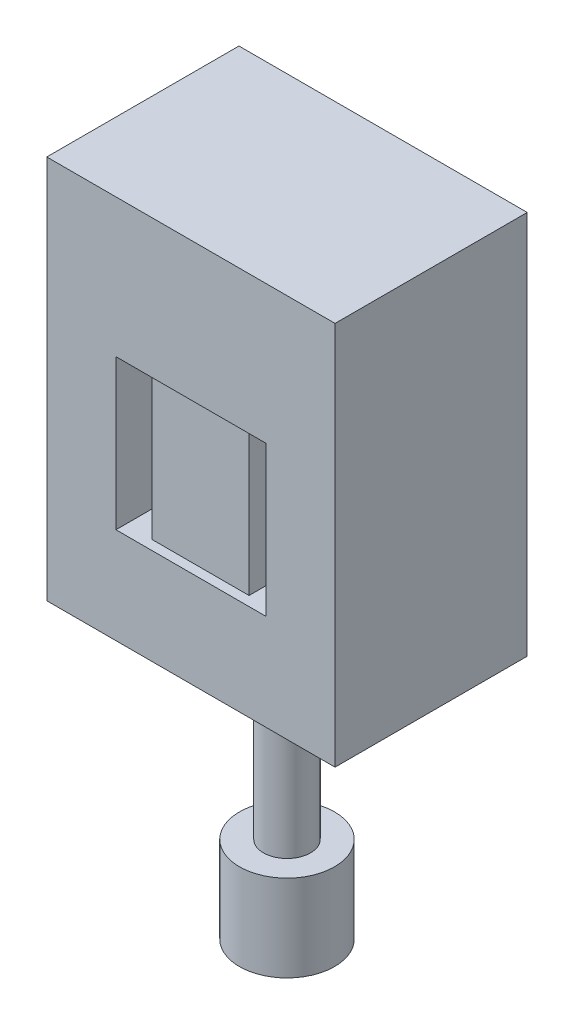
ISO-10303-21;
HEADER;
FILE_DESCRIPTION(('STEP AP214'),'2;1');
FILE_NAME('part.step','',(''),(''),'','','');
FILE_SCHEMA(('AUTOMOTIVE_DESIGN { 1 0 10303 214 1 1 1 1 }'));
ENDSEC;
DATA;
#1=APPLICATION_CONTEXT('core data for automotive mechanical design processes');
#2=APPLICATION_PROTOCOL_DEFINITION('international standard','automotive_design',2000,#1);
#3=PRODUCT_CONTEXT('',#1,'mechanical');
#4=PRODUCT('Part','Part','',(#3));
#5=PRODUCT_RELATED_PRODUCT_CATEGORY('part','',(#4));
#6=PRODUCT_DEFINITION_FORMATION('','',#4);
#7=PRODUCT_DEFINITION_CONTEXT('part definition',#1,'design');
#8=PRODUCT_DEFINITION('design','',#6,#7);
#9=PRODUCT_DEFINITION_SHAPE('','',#8);
#10=(LENGTH_UNIT() NAMED_UNIT(*) SI_UNIT(.MILLI.,.METRE.));
#11=(NAMED_UNIT(*) PLANE_ANGLE_UNIT() SI_UNIT($,.RADIAN.));
#12=(NAMED_UNIT(*) SI_UNIT($,.STERADIAN.) SOLID_ANGLE_UNIT());
#13=UNCERTAINTY_MEASURE_WITH_UNIT(LENGTH_MEASURE(1.E-05),#10,'distance_accuracy_value','');
#14=(GEOMETRIC_REPRESENTATION_CONTEXT(3) GLOBAL_UNCERTAINTY_ASSIGNED_CONTEXT((#13)) GLOBAL_UNIT_ASSIGNED_CONTEXT((#10,
#11,#12)) REPRESENTATION_CONTEXT('',''));
#15=CARTESIAN_POINT('',(0.,0.,0.));
#16=DIRECTION('',(0.,0.,1.));
#17=DIRECTION('',(1.,0.,0.));
#18=AXIS2_PLACEMENT_3D('',#15,#16,#17);
#19=CARTESIAN_POINT('',(0.,0.,9.));
#20=DIRECTION('',(0.,0.,-1.));
#21=DIRECTION('',(-1.,0.,0.));
#22=AXIS2_PLACEMENT_3D('',#19,#20,#21);
#23=PLANE('',#22);
#24=DIRECTION('',(0.,1.,0.));
#25=VECTOR('',#24,1.);
#26=CARTESIAN_POINT('',(-5.05,25.6,9.));
#27=LINE('',#26,#25);
#28=CARTESIAN_POINT('',(-5.05,10.,9.));
#29=VERTEX_POINT('',#28);
#30=CARTESIAN_POINT('',(-5.05,25.6,9.));
#31=VERTEX_POINT('',#30);
#32=EDGE_CURVE('E164',#29,#31,#27,.T.);
#33=ORIENTED_EDGE('',*,*,#32,.F.);
#34=DIRECTION('',(1.,0.,0.));
#35=VECTOR('',#34,1.);
#36=CARTESIAN_POINT('',(-7.8,10.,9.));
#37=LINE('',#36,#35);
#38=CARTESIAN_POINT('',(5.05,10.,9.));
#39=VERTEX_POINT('',#38);
#40=EDGE_CURVE('E207',#29,#39,#37,.T.);
#41=ORIENTED_EDGE('',*,*,#40,.T.);
#42=DIRECTION('',(0.,-1.,0.));
#43=VECTOR('',#42,1.);
#44=CARTESIAN_POINT('',(5.05,25.6,9.));
#45=LINE('',#44,#43);
#46=CARTESIAN_POINT('',(5.05,25.6,9.));
#47=VERTEX_POINT('',#46);
#48=EDGE_CURVE('E167',#47,#39,#45,.T.);
#49=ORIENTED_EDGE('',*,*,#48,.F.);
#50=DIRECTION('',(-1.,0.,0.));
#51=VECTOR('',#50,1.);
#52=CARTESIAN_POINT('',(-7.8,25.6,9.));
#53=LINE('',#52,#51);
#54=EDGE_CURVE('E203',#47,#31,#53,.T.);
#55=ORIENTED_EDGE('',*,*,#54,.T.);
#56=EDGE_LOOP('',(#33,#41,#49,#55));
#57=FACE_BOUND('',#56,.T.);
#58=ADVANCED_FACE('F44',(#57),#23,.F.);
#59=CARTESIAN_POINT('',(15.,40.,10.));
#60=DIRECTION('',(-1.,0.,0.));
#61=DIRECTION('',(0.,0.,1.));
#62=AXIS2_PLACEMENT_3D('',#59,#60,#61);
#63=PLANE('',#62);
#64=DIRECTION('',(0.,0.,-1.));
#65=VECTOR('',#64,1.);
#66=CARTESIAN_POINT('',(15.,0.,10.));
#67=LINE('',#66,#65);
#68=CARTESIAN_POINT('',(15.,0.,10.));
#69=VERTEX_POINT('',#68);
#70=CARTESIAN_POINT('',(15.,0.,-10.));
#71=VERTEX_POINT('',#70);
#72=EDGE_CURVE('E242',#69,#71,#67,.T.);
#73=ORIENTED_EDGE('',*,*,#72,.T.);
#74=DIRECTION('',(0.,-1.,0.));
#75=VECTOR('',#74,1.);
#76=CARTESIAN_POINT('',(15.,40.,-10.));
#77=LINE('',#76,#75);
#78=CARTESIAN_POINT('',(15.,40.,-10.));
#79=VERTEX_POINT('',#78);
#80=EDGE_CURVE('E280',#79,#71,#77,.T.);
#81=ORIENTED_EDGE('',*,*,#80,.F.);
#82=DIRECTION('',(0.,0.,-1.));
#83=VECTOR('',#82,1.);
#84=CARTESIAN_POINT('',(15.,40.,10.));
#85=LINE('',#84,#83);
#86=CARTESIAN_POINT('',(15.,40.,10.));
#87=VERTEX_POINT('',#86);
#88=EDGE_CURVE('E243',#87,#79,#85,.T.);
#89=ORIENTED_EDGE('',*,*,#88,.F.);
#90=DIRECTION('',(0.,-1.,0.));
#91=VECTOR('',#90,1.);
#92=CARTESIAN_POINT('',(15.,40.,10.));
#93=LINE('',#92,#91);
#94=EDGE_CURVE('E257',#87,#69,#93,.T.);
#95=ORIENTED_EDGE('',*,*,#94,.T.);
#96=EDGE_LOOP('',(#73,#81,#89,#95));
#97=FACE_BOUND('',#96,.T.);
#98=ADVANCED_FACE('F300',(#97),#63,.F.);
#99=CARTESIAN_POINT('',(-15.,40.,-10.));
#100=DIRECTION('',(0.,0.,1.));
#101=DIRECTION('',(1.,0.,0.));
#102=AXIS2_PLACEMENT_3D('',#99,#100,#101);
#103=PLANE('',#102);
#104=DIRECTION('',(-1.,0.,0.));
#105=VECTOR('',#104,1.);
#106=CARTESIAN_POINT('',(-15.,0.,-10.));
#107=LINE('',#106,#105);
#108=CARTESIAN_POINT('',(-15.,0.,-10.));
#109=VERTEX_POINT('',#108);
#110=EDGE_CURVE('E261',#71,#109,#107,.T.);
#111=ORIENTED_EDGE('',*,*,#110,.T.);
#112=DIRECTION('',(0.,-1.,0.));
#113=VECTOR('',#112,1.);
#114=CARTESIAN_POINT('',(-15.,40.,-10.));
#115=LINE('',#114,#113);
#116=CARTESIAN_POINT('',(-15.,40.,-10.));
#117=VERTEX_POINT('',#116);
#118=EDGE_CURVE('E276',#117,#109,#115,.T.);
#119=ORIENTED_EDGE('',*,*,#118,.F.);
#120=DIRECTION('',(-1.,0.,0.));
#121=VECTOR('',#120,1.);
#122=CARTESIAN_POINT('',(-15.,40.,-10.));
#123=LINE('',#122,#121);
#124=EDGE_CURVE('E247',#79,#117,#123,.T.);
#125=ORIENTED_EDGE('',*,*,#124,.F.);
#126=ORIENTED_EDGE('',*,*,#80,.T.);
#127=EDGE_LOOP('',(#111,#119,#125,#126));
#128=FACE_BOUND('',#127,.T.);
#129=ADVANCED_FACE('F308',(#128),#103,.F.);
#130=CARTESIAN_POINT('',(-15.,40.,10.));
#131=DIRECTION('',(1.,0.,0.));
#132=DIRECTION('',(0.,0.,-1.));
#133=AXIS2_PLACEMENT_3D('',#130,#131,#132);
#134=PLANE('',#133);
#135=DIRECTION('',(0.,0.,1.));
#136=VECTOR('',#135,1.);
#137=CARTESIAN_POINT('',(-15.,0.,10.));
#138=LINE('',#137,#136);
#139=CARTESIAN_POINT('',(-15.,0.,10.));
#140=VERTEX_POINT('',#139);
#141=EDGE_CURVE('E264',#109,#140,#138,.T.);
#142=ORIENTED_EDGE('',*,*,#141,.T.);
#143=DIRECTION('',(0.,-1.,0.));
#144=VECTOR('',#143,1.);
#145=CARTESIAN_POINT('',(-15.,40.,10.));
#146=LINE('',#145,#144);
#147=CARTESIAN_POINT('',(-15.,40.,10.));
#148=VERTEX_POINT('',#147);
#149=EDGE_CURVE('E272',#148,#140,#146,.T.);
#150=ORIENTED_EDGE('',*,*,#149,.F.);
#151=DIRECTION('',(0.,0.,1.));
#152=VECTOR('',#151,1.);
#153=CARTESIAN_POINT('',(-15.,40.,10.));
#154=LINE('',#153,#152);
#155=EDGE_CURVE('E251',#117,#148,#154,.T.);
#156=ORIENTED_EDGE('',*,*,#155,.F.);
#157=ORIENTED_EDGE('',*,*,#118,.T.);
#158=EDGE_LOOP('',(#142,#150,#156,#157));
#159=FACE_BOUND('',#158,.T.);
#160=ADVANCED_FACE('F349',(#159),#134,.F.);
#161=CARTESIAN_POINT('',(-15.,40.,10.));
#162=DIRECTION('',(0.,0.,-1.));
#163=DIRECTION('',(-1.,0.,0.));
#164=AXIS2_PLACEMENT_3D('',#161,#162,#163);
#165=PLANE('',#164);
#166=DIRECTION('',(-1.,0.,0.));
#167=VECTOR('',#166,1.);
#168=CARTESIAN_POINT('',(-7.8,25.6,10.));
#169=LINE('',#168,#167);
#170=CARTESIAN_POINT('',(7.79999999999999,25.6,10.));
#171=VERTEX_POINT('',#170);
#172=CARTESIAN_POINT('',(-7.8,25.6,10.));
#173=VERTEX_POINT('',#172);
#174=EDGE_CURVE('E215',#171,#173,#169,.T.);
#175=ORIENTED_EDGE('',*,*,#174,.F.);
#176=DIRECTION('',(0.,1.,0.));
#177=VECTOR('',#176,1.);
#178=CARTESIAN_POINT('',(7.79999999999999,10.,10.));
#179=LINE('',#178,#177);
#180=CARTESIAN_POINT('',(7.79999999999999,10.,10.));
#181=VERTEX_POINT('',#180);
#182=EDGE_CURVE('E177',#181,#171,#179,.T.);
#183=ORIENTED_EDGE('',*,*,#182,.F.);
#184=DIRECTION('',(1.,0.,0.));
#185=VECTOR('',#184,1.);
#186=CARTESIAN_POINT('',(-7.8,10.,10.));
#187=LINE('',#186,#185);
#188=CARTESIAN_POINT('',(-7.8,10.,10.));
#189=VERTEX_POINT('',#188);
#190=EDGE_CURVE('E208',#189,#181,#187,.T.);
#191=ORIENTED_EDGE('',*,*,#190,.F.);
#192=DIRECTION('',(0.,-1.,0.));
#193=VECTOR('',#192,1.);
#194=CARTESIAN_POINT('',(-7.8,10.,10.));
#195=LINE('',#194,#193);
#196=EDGE_CURVE('E143',#173,#189,#195,.T.);
#197=ORIENTED_EDGE('',*,*,#196,.F.);
#198=EDGE_LOOP('',(#175,#183,#191,#197));
#199=FACE_BOUND('',#198,.T.);
#200=DIRECTION('',(1.,0.,0.));
#201=VECTOR('',#200,1.);
#202=CARTESIAN_POINT('',(-15.,0.,10.));
#203=LINE('',#202,#201);
#204=EDGE_CURVE('E248',#140,#69,#203,.T.);
#205=ORIENTED_EDGE('',*,*,#204,.T.);
#206=ORIENTED_EDGE('',*,*,#94,.F.);
#207=DIRECTION('',(1.,0.,0.));
#208=VECTOR('',#207,1.);
#209=CARTESIAN_POINT('',(-15.,40.,10.));
#210=LINE('',#209,#208);
#211=EDGE_CURVE('E254',#148,#87,#210,.T.);
#212=ORIENTED_EDGE('',*,*,#211,.F.);
#213=ORIENTED_EDGE('',*,*,#149,.T.);
#214=EDGE_LOOP('',(#205,#206,#212,#213));
#215=FACE_BOUND('',#214,.T.);
#216=ADVANCED_FACE('F343',(#199,#215),#165,.F.);
#217=CARTESIAN_POINT('',(0.,40.,0.));
#218=DIRECTION('',(0.,-1.,0.));
#219=DIRECTION('',(0.,0.,-1.));
#220=AXIS2_PLACEMENT_3D('',#217,#218,#219);
#221=PLANE('',#220);
#222=ORIENTED_EDGE('',*,*,#88,.T.);
#223=ORIENTED_EDGE('',*,*,#124,.T.);
#224=ORIENTED_EDGE('',*,*,#155,.T.);
#225=ORIENTED_EDGE('',*,*,#211,.T.);
#226=EDGE_LOOP('',(#222,#223,#224,#225));
#227=FACE_BOUND('',#226,.T.);
#228=ADVANCED_FACE('F340',(#227),#221,.F.);
#229=CARTESIAN_POINT('',(0.,0.,0.));
#230=DIRECTION('',(0.,-1.,0.));
#231=DIRECTION('',(0.,0.,-1.));
#232=AXIS2_PLACEMENT_3D('',#229,#230,#231);
#233=PLANE('',#232);
#234=CARTESIAN_POINT('',(0.,0.,0.));
#235=DIRECTION('',(0.,-1.,0.));
#236=DIRECTION('',(0.,0.,-1.));
#237=AXIS2_PLACEMENT_3D('',#234,#235,#236);
#238=CIRCLE('',#237,5.45);
#239=CARTESIAN_POINT('',(0.,0.,-5.45));
#240=VERTEX_POINT('',#239);
#241=EDGE_CURVE('E11',#240,#240,#238,.F.);
#242=ORIENTED_EDGE('',*,*,#241,.T.);
#243=EDGE_LOOP('',(#242));
#244=FACE_BOUND('',#243,.T.);
#245=ORIENTED_EDGE('',*,*,#72,.F.);
#246=ORIENTED_EDGE('',*,*,#204,.F.);
#247=ORIENTED_EDGE('',*,*,#141,.F.);
#248=ORIENTED_EDGE('',*,*,#110,.F.);
#249=EDGE_LOOP('',(#245,#246,#247,#248));
#250=FACE_BOUND('',#249,.T.);
#251=ADVANCED_FACE('F339',(#244,#250),#233,.T.);
#252=CARTESIAN_POINT('',(0.,-19.,0.));
#253=DIRECTION('',(0.,1.,0.));
#254=DIRECTION('',(0.,0.,1.));
#255=AXIS2_PLACEMENT_3D('',#252,#253,#254);
#256=CYLINDRICAL_SURFACE('',#255,2.45);
#257=CARTESIAN_POINT('',(0.,-3.,0.));
#258=DIRECTION('',(0.,-1.,0.));
#259=DIRECTION('',(0.,0.,-1.));
#260=AXIS2_PLACEMENT_3D('',#257,#258,#259);
#261=CIRCLE('',#260,2.45);
#262=CARTESIAN_POINT('',(0.,-3.,-2.45));
#263=VERTEX_POINT('',#262);
#264=EDGE_CURVE('E53',#263,#263,#261,.T.);
#265=ORIENTED_EDGE('',*,*,#264,.T.);
#266=EDGE_LOOP('',(#265));
#267=FACE_BOUND('',#266,.T.);
#268=CARTESIAN_POINT('',(0.,-19.,0.));
#269=DIRECTION('',(0.,-1.,0.));
#270=DIRECTION('',(0.,0.,-1.));
#271=AXIS2_PLACEMENT_3D('',#268,#269,#270);
#272=CIRCLE('',#271,2.45);
#273=CARTESIAN_POINT('',(0.,-19.,-2.45));
#274=VERTEX_POINT('',#273);
#275=EDGE_CURVE('E235',#274,#274,#272,.T.);
#276=ORIENTED_EDGE('',*,*,#275,.F.);
#277=EDGE_LOOP('',(#276));
#278=FACE_BOUND('',#277,.T.);
#279=ADVANCED_FACE('F287',(#267,#278),#256,.T.);
#280=CARTESIAN_POINT('',(0.,-28.,0.));
#281=DIRECTION('',(0.,1.,0.));
#282=DIRECTION('',(0.,0.,1.));
#283=AXIS2_PLACEMENT_3D('',#280,#281,#282);
#284=CYLINDRICAL_SURFACE('',#283,4.95);
#285=CARTESIAN_POINT('',(0.,-28.,0.));
#286=DIRECTION('',(0.,-1.,0.));
#287=DIRECTION('',(0.,0.,-1.));
#288=AXIS2_PLACEMENT_3D('',#285,#286,#287);
#289=CIRCLE('',#288,4.95);
#290=CARTESIAN_POINT('',(0.,-28.,-4.95));
#291=VERTEX_POINT('',#290);
#292=EDGE_CURVE('E231',#291,#291,#289,.T.);
#293=ORIENTED_EDGE('',*,*,#292,.F.);
#294=EDGE_LOOP('',(#293));
#295=FACE_BOUND('',#294,.T.);
#296=CARTESIAN_POINT('',(0.,-19.,0.));
#297=DIRECTION('',(0.,-1.,0.));
#298=DIRECTION('',(0.,0.,-1.));
#299=AXIS2_PLACEMENT_3D('',#296,#297,#298);
#300=CIRCLE('',#299,4.95);
#301=CARTESIAN_POINT('',(0.,-19.,-4.95));
#302=VERTEX_POINT('',#301);
#303=EDGE_CURVE('E224',#302,#302,#300,.T.);
#304=ORIENTED_EDGE('',*,*,#303,.T.);
#305=EDGE_LOOP('',(#304));
#306=FACE_BOUND('',#305,.T.);
#307=ADVANCED_FACE('F330',(#295,#306),#284,.T.);
#308=CARTESIAN_POINT('',(0.,-28.,0.));
#309=DIRECTION('',(0.,-1.,0.));
#310=DIRECTION('',(0.,0.,-1.));
#311=AXIS2_PLACEMENT_3D('',#308,#309,#310);
#312=PLANE('',#311);
#313=ORIENTED_EDGE('',*,*,#292,.T.);
#314=EDGE_LOOP('',(#313));
#315=FACE_BOUND('',#314,.T.);
#316=ADVANCED_FACE('F327',(#315),#312,.T.);
#317=CARTESIAN_POINT('',(0.,-19.,0.));
#318=DIRECTION('',(0.,-1.,0.));
#319=DIRECTION('',(0.,0.,-1.));
#320=AXIS2_PLACEMENT_3D('',#317,#318,#319);
#321=PLANE('',#320);
#322=ORIENTED_EDGE('',*,*,#275,.T.);
#323=EDGE_LOOP('',(#322));
#324=FACE_BOUND('',#323,.T.);
#325=ORIENTED_EDGE('',*,*,#303,.F.);
#326=EDGE_LOOP('',(#325));
#327=FACE_BOUND('',#326,.T.);
#328=ADVANCED_FACE('F325',(#324,#327),#321,.F.);
#329=CARTESIAN_POINT('',(7.79999999999999,10.,9.));
#330=DIRECTION('',(1.,0.,0.));
#331=DIRECTION('',(0.,1.,0.));
#332=AXIS2_PLACEMENT_3D('',#329,#330,#331);
#333=PLANE('',#332);
#334=ORIENTED_EDGE('',*,*,#182,.T.);
#335=DIRECTION('',(0.,0.,1.));
#336=VECTOR('',#335,1.);
#337=CARTESIAN_POINT('',(7.8,25.6,9.));
#338=LINE('',#337,#336);
#339=CARTESIAN_POINT('',(7.79999999999999,25.6,6.));
#340=VERTEX_POINT('',#339);
#341=EDGE_CURVE('E212',#340,#171,#338,.T.);
#342=ORIENTED_EDGE('',*,*,#341,.F.);
#343=DIRECTION('',(0.,1.,0.));
#344=VECTOR('',#343,1.);
#345=CARTESIAN_POINT('',(7.79999999999999,25.6,6.));
#346=LINE('',#345,#344);
#347=CARTESIAN_POINT('',(7.79999999999999,10.,6.));
#348=VERTEX_POINT('',#347);
#349=EDGE_CURVE('E188',#348,#340,#346,.T.);
#350=ORIENTED_EDGE('',*,*,#349,.F.);
#351=DIRECTION('',(0.,0.,1.));
#352=VECTOR('',#351,1.);
#353=CARTESIAN_POINT('',(7.79999999999999,10.,9.));
#354=LINE('',#353,#352);
#355=EDGE_CURVE('E148',#348,#181,#354,.T.);
#356=ORIENTED_EDGE('',*,*,#355,.T.);
#357=EDGE_LOOP('',(#334,#342,#350,#356));
#358=FACE_BOUND('',#357,.T.);
#359=ADVANCED_FACE('F316',(#358),#333,.F.);
#360=CARTESIAN_POINT('',(-7.8,10.,9.));
#361=DIRECTION('',(0.,-1.,0.));
#362=DIRECTION('',(0.,0.,-1.));
#363=AXIS2_PLACEMENT_3D('',#360,#361,#362);
#364=PLANE('',#363);
#365=ORIENTED_EDGE('',*,*,#190,.T.);
#366=ORIENTED_EDGE('',*,*,#355,.F.);
#367=DIRECTION('',(1.,0.,0.));
#368=VECTOR('',#367,1.);
#369=CARTESIAN_POINT('',(7.79999999999999,10.,6.));
#370=LINE('',#369,#368);
#371=CARTESIAN_POINT('',(5.05,10.,6.));
#372=VERTEX_POINT('',#371);
#373=EDGE_CURVE('E182',#372,#348,#370,.T.);
#374=ORIENTED_EDGE('',*,*,#373,.F.);
#375=DIRECTION('',(0.,0.,1.));
#376=VECTOR('',#375,1.);
#377=CARTESIAN_POINT('',(5.05,10.,6.));
#378=LINE('',#377,#376);
#379=EDGE_CURVE('E183',#372,#39,#378,.T.);
#380=ORIENTED_EDGE('',*,*,#379,.T.);
#381=ORIENTED_EDGE('',*,*,#40,.F.);
#382=DIRECTION('',(0.,0.,1.));
#383=VECTOR('',#382,1.);
#384=CARTESIAN_POINT('',(-5.05,10.,6.));
#385=LINE('',#384,#383);
#386=CARTESIAN_POINT('',(-5.05,10.,6.));
#387=VERTEX_POINT('',#386);
#388=EDGE_CURVE('E60',#387,#29,#385,.T.);
#389=ORIENTED_EDGE('',*,*,#388,.F.);
#390=DIRECTION('',(1.,0.,0.));
#391=VECTOR('',#390,1.);
#392=CARTESIAN_POINT('',(-7.8,10.,6.));
#393=LINE('',#392,#391);
#394=CARTESIAN_POINT('',(-7.8,10.,6.));
#395=VERTEX_POINT('',#394);
#396=EDGE_CURVE('E152',#395,#387,#393,.T.);
#397=ORIENTED_EDGE('',*,*,#396,.F.);
#398=DIRECTION('',(0.,0.,1.));
#399=VECTOR('',#398,1.);
#400=CARTESIAN_POINT('',(-7.8,10.,9.));
#401=LINE('',#400,#399);
#402=EDGE_CURVE('E136',#395,#189,#401,.T.);
#403=ORIENTED_EDGE('',*,*,#402,.T.);
#404=EDGE_LOOP('',(#365,#366,#374,#380,#381,#389,#397,#403));
#405=FACE_BOUND('',#404,.T.);
#406=ADVANCED_FACE('F153',(#405),#364,.F.);
#407=CARTESIAN_POINT('',(-7.8,10.,9.));
#408=DIRECTION('',(-1.,0.,0.));
#409=DIRECTION('',(0.,0.,1.));
#410=AXIS2_PLACEMENT_3D('',#407,#408,#409);
#411=PLANE('',#410);
#412=ORIENTED_EDGE('',*,*,#196,.T.);
#413=ORIENTED_EDGE('',*,*,#402,.F.);
#414=DIRECTION('',(0.,-1.,0.));
#415=VECTOR('',#414,1.);
#416=CARTESIAN_POINT('',(-7.8,25.6,6.));
#417=LINE('',#416,#415);
#418=CARTESIAN_POINT('',(-7.8,25.6,6.));
#419=VERTEX_POINT('',#418);
#420=EDGE_CURVE('E140',#419,#395,#417,.T.);
#421=ORIENTED_EDGE('',*,*,#420,.F.);
#422=DIRECTION('',(0.,0.,1.));
#423=VECTOR('',#422,1.);
#424=CARTESIAN_POINT('',(-7.8,25.6,9.));
#425=LINE('',#424,#423);
#426=EDGE_CURVE('E149',#419,#173,#425,.T.);
#427=ORIENTED_EDGE('',*,*,#426,.T.);
#428=EDGE_LOOP('',(#412,#413,#421,#427));
#429=FACE_BOUND('',#428,.T.);
#430=ADVANCED_FACE('F138',(#429),#411,.F.);
#431=CARTESIAN_POINT('',(-7.8,25.6,9.));
#432=DIRECTION('',(0.,1.,0.));
#433=DIRECTION('',(0.,0.,1.));
#434=AXIS2_PLACEMENT_3D('',#431,#432,#433);
#435=PLANE('',#434);
#436=ORIENTED_EDGE('',*,*,#174,.T.);
#437=ORIENTED_EDGE('',*,*,#426,.F.);
#438=DIRECTION('',(-1.,0.,0.));
#439=VECTOR('',#438,1.);
#440=CARTESIAN_POINT('',(-7.8,25.6,6.));
#441=LINE('',#440,#439);
#442=CARTESIAN_POINT('',(-5.05,25.6,6.));
#443=VERTEX_POINT('',#442);
#444=EDGE_CURVE('E162',#443,#419,#441,.T.);
#445=ORIENTED_EDGE('',*,*,#444,.F.);
#446=DIRECTION('',(0.,0.,1.));
#447=VECTOR('',#446,1.);
#448=CARTESIAN_POINT('',(-5.05,25.6,6.));
#449=LINE('',#448,#447);
#450=EDGE_CURVE('E174',#443,#31,#449,.T.);
#451=ORIENTED_EDGE('',*,*,#450,.T.);
#452=ORIENTED_EDGE('',*,*,#54,.F.);
#453=DIRECTION('',(0.,0.,1.));
#454=VECTOR('',#453,1.);
#455=CARTESIAN_POINT('',(5.05,25.6,6.));
#456=LINE('',#455,#454);
#457=CARTESIAN_POINT('',(5.05,25.6,6.));
#458=VERTEX_POINT('',#457);
#459=EDGE_CURVE('E68',#458,#47,#456,.T.);
#460=ORIENTED_EDGE('',*,*,#459,.F.);
#461=DIRECTION('',(-1.,0.,0.));
#462=VECTOR('',#461,1.);
#463=CARTESIAN_POINT('',(7.79999999999999,25.6,6.));
#464=LINE('',#463,#462);
#465=EDGE_CURVE('E196',#340,#458,#464,.T.);
#466=ORIENTED_EDGE('',*,*,#465,.F.);
#467=ORIENTED_EDGE('',*,*,#341,.T.);
#468=EDGE_LOOP('',(#436,#437,#445,#451,#452,#460,#466,#467));
#469=FACE_BOUND('',#468,.T.);
#470=ADVANCED_FACE('F319',(#469),#435,.F.);
#471=CARTESIAN_POINT('',(5.05,25.6,6.));
#472=DIRECTION('',(-1.,0.,0.));
#473=DIRECTION('',(0.,-1.,0.));
#474=AXIS2_PLACEMENT_3D('',#471,#472,#473);
#475=PLANE('',#474);
#476=ORIENTED_EDGE('',*,*,#48,.T.);
#477=ORIENTED_EDGE('',*,*,#379,.F.);
#478=DIRECTION('',(0.,-1.,0.));
#479=VECTOR('',#478,1.);
#480=CARTESIAN_POINT('',(5.05,25.6,6.));
#481=LINE('',#480,#479);
#482=EDGE_CURVE('E192',#458,#372,#481,.T.);
#483=ORIENTED_EDGE('',*,*,#482,.F.);
#484=ORIENTED_EDGE('',*,*,#459,.T.);
#485=EDGE_LOOP('',(#476,#477,#483,#484));
#486=FACE_BOUND('',#485,.T.);
#487=ADVANCED_FACE('F322',(#486),#475,.F.);
#488=CARTESIAN_POINT('',(0.,0.,6.));
#489=DIRECTION('',(0.,0.,-1.));
#490=DIRECTION('',(-1.,0.,0.));
#491=AXIS2_PLACEMENT_3D('',#488,#489,#490);
#492=PLANE('',#491);
#493=ORIENTED_EDGE('',*,*,#349,.T.);
#494=ORIENTED_EDGE('',*,*,#465,.T.);
#495=ORIENTED_EDGE('',*,*,#482,.T.);
#496=ORIENTED_EDGE('',*,*,#373,.T.);
#497=EDGE_LOOP('',(#493,#494,#495,#496));
#498=FACE_BOUND('',#497,.T.);
#499=ADVANCED_FACE('F312',(#498),#492,.F.);
#500=CARTESIAN_POINT('',(-5.05,25.6,6.));
#501=DIRECTION('',(1.,0.,0.));
#502=DIRECTION('',(0.,0.,-1.));
#503=AXIS2_PLACEMENT_3D('',#500,#501,#502);
#504=PLANE('',#503);
#505=ORIENTED_EDGE('',*,*,#32,.T.);
#506=ORIENTED_EDGE('',*,*,#450,.F.);
#507=DIRECTION('',(0.,1.,0.));
#508=VECTOR('',#507,1.);
#509=CARTESIAN_POINT('',(-5.05,25.6,6.));
#510=LINE('',#509,#508);
#511=EDGE_CURVE('E158',#387,#443,#510,.T.);
#512=ORIENTED_EDGE('',*,*,#511,.F.);
#513=ORIENTED_EDGE('',*,*,#388,.T.);
#514=EDGE_LOOP('',(#505,#506,#512,#513));
#515=FACE_BOUND('',#514,.T.);
#516=ADVANCED_FACE('F296',(#515),#504,.F.);
#517=CARTESIAN_POINT('',(0.,0.,6.));
#518=DIRECTION('',(0.,0.,1.));
#519=DIRECTION('',(1.,0.,0.));
#520=AXIS2_PLACEMENT_3D('',#517,#518,#519);
#521=PLANE('',#520);
#522=ORIENTED_EDGE('',*,*,#420,.T.);
#523=ORIENTED_EDGE('',*,*,#396,.T.);
#524=ORIENTED_EDGE('',*,*,#511,.T.);
#525=ORIENTED_EDGE('',*,*,#444,.T.);
#526=EDGE_LOOP('',(#522,#523,#524,#525));
#527=FACE_BOUND('',#526,.T.);
#528=ADVANCED_FACE('F160',(#527),#521,.T.);
#529=CARTESIAN_POINT('',(0.,-3.,0.));
#530=DIRECTION('',(0.,-1.,0.));
#531=DIRECTION('',(0.,0.,-1.));
#532=AXIS2_PLACEMENT_3D('',#529,#530,#531);
#533=TOROIDAL_SURFACE('',#532,5.45,3.);
#534=ORIENTED_EDGE('',*,*,#241,.F.);
#535=EDGE_LOOP('',(#534));
#536=FACE_BOUND('',#535,.T.);
#537=ORIENTED_EDGE('',*,*,#264,.F.);
#538=EDGE_LOOP('',(#537));
#539=FACE_BOUND('',#538,.T.);
#540=ADVANCED_FACE('F46',(#536,#539),#533,.F.);
#541=CLOSED_SHELL('',(#58,#98,#129,#160,#216,#228,#251,#279,#307,#316,#328,#359,#406,#430,#470,
#487,#499,#516,#528,#540));
#542=MANIFOLD_SOLID_BREP('B2',#541);
#543=ADVANCED_BREP_SHAPE_REPRESENTATION('',(#18,#542),#14);
#544=SHAPE_DEFINITION_REPRESENTATION(#9,#543);
ENDSEC;
END-ISO-10303-21;
